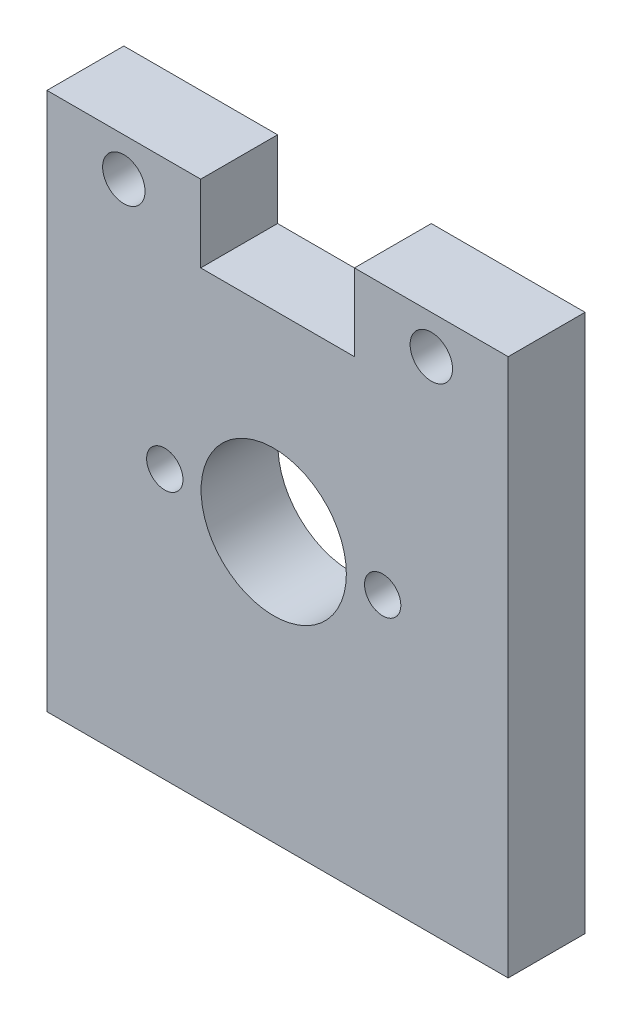
ISO-10303-21;
HEADER;
FILE_DESCRIPTION(('STEP AP214'),'2;1');
FILE_NAME('part.step','',(''),(''),'','','');
FILE_SCHEMA(('AUTOMOTIVE_DESIGN { 1 0 10303 214 1 1 1 1 }'));
ENDSEC;
DATA;
#1=APPLICATION_CONTEXT('core data for automotive mechanical design processes');
#2=APPLICATION_PROTOCOL_DEFINITION('international standard','automotive_design',2000,#1);
#3=PRODUCT_CONTEXT('',#1,'mechanical');
#4=PRODUCT('Part','Part','',(#3));
#5=PRODUCT_RELATED_PRODUCT_CATEGORY('part','',(#4));
#6=PRODUCT_DEFINITION_FORMATION('','',#4);
#7=PRODUCT_DEFINITION_CONTEXT('part definition',#1,'design');
#8=PRODUCT_DEFINITION('design','',#6,#7);
#9=PRODUCT_DEFINITION_SHAPE('','',#8);
#10=(LENGTH_UNIT() NAMED_UNIT(*) SI_UNIT(.MILLI.,.METRE.));
#11=(NAMED_UNIT(*) PLANE_ANGLE_UNIT() SI_UNIT($,.RADIAN.));
#12=(NAMED_UNIT(*) SI_UNIT($,.STERADIAN.) SOLID_ANGLE_UNIT());
#13=UNCERTAINTY_MEASURE_WITH_UNIT(LENGTH_MEASURE(1.E-05),#10,'distance_accuracy_value','');
#14=(GEOMETRIC_REPRESENTATION_CONTEXT(3) GLOBAL_UNCERTAINTY_ASSIGNED_CONTEXT((#13)) GLOBAL_UNIT_ASSIGNED_CONTEXT((#10,
#11,#12)) REPRESENTATION_CONTEXT('',''));
#15=CARTESIAN_POINT('',(0.,0.,0.));
#16=DIRECTION('',(0.,0.,1.));
#17=DIRECTION('',(1.,0.,0.));
#18=AXIS2_PLACEMENT_3D('',#15,#16,#17);
#19=CARTESIAN_POINT('',(0.,0.,3.175));
#20=DIRECTION('',(0.,-1.,0.));
#21=DIRECTION('',(0.,0.,-1.));
#22=AXIS2_PLACEMENT_3D('',#19,#20,#21);
#23=PLANE('',#22);
#24=DIRECTION('',(-1.,0.,0.));
#25=VECTOR('',#24,1.);
#26=CARTESIAN_POINT('',(0.,0.,-3.175));
#27=LINE('',#26,#25);
#28=CARTESIAN_POINT('',(38.1,0.,-3.175));
#29=VERTEX_POINT('',#28);
#30=CARTESIAN_POINT('',(25.4,0.,-3.175));
#31=VERTEX_POINT('',#30);
#32=EDGE_CURVE('E127',#29,#31,#27,.T.);
#33=ORIENTED_EDGE('',*,*,#32,.T.);
#34=DIRECTION('',(0.,0.,1.));
#35=VECTOR('',#34,1.);
#36=CARTESIAN_POINT('',(25.4,0.,-3.176));
#37=LINE('',#36,#35);
#38=CARTESIAN_POINT('',(25.4,0.,3.175));
#39=VERTEX_POINT('',#38);
#40=EDGE_CURVE('E110',#31,#39,#37,.T.);
#41=ORIENTED_EDGE('',*,*,#40,.T.);
#42=DIRECTION('',(-1.,0.,0.));
#43=VECTOR('',#42,1.);
#44=CARTESIAN_POINT('',(0.,0.,3.175));
#45=LINE('',#44,#43);
#46=CARTESIAN_POINT('',(38.1,0.,3.175));
#47=VERTEX_POINT('',#46);
#48=EDGE_CURVE('E142',#47,#39,#45,.T.);
#49=ORIENTED_EDGE('',*,*,#48,.F.);
#50=DIRECTION('',(0.,0.,-1.));
#51=VECTOR('',#50,1.);
#52=CARTESIAN_POINT('',(38.1,0.,3.175));
#53=LINE('',#52,#51);
#54=EDGE_CURVE('E132',#47,#29,#53,.T.);
#55=ORIENTED_EDGE('',*,*,#54,.T.);
#56=EDGE_LOOP('',(#33,#41,#49,#55));
#57=FACE_BOUND('',#56,.T.);
#58=ADVANCED_FACE('F35',(#57),#23,.F.);
#59=CARTESIAN_POINT('',(0.,0.,3.175));
#60=DIRECTION('',(1.,0.,0.));
#61=DIRECTION('',(0.,1.,0.));
#62=AXIS2_PLACEMENT_3D('',#59,#60,#61);
#63=PLANE('',#62);
#64=DIRECTION('',(0.,-1.,0.));
#65=VECTOR('',#64,1.);
#66=CARTESIAN_POINT('',(0.,0.,-3.175));
#67=LINE('',#66,#65);
#68=CARTESIAN_POINT('',(0.,0.,-3.175));
#69=VERTEX_POINT('',#68);
#70=CARTESIAN_POINT('',(0.,-44.45,-3.175));
#71=VERTEX_POINT('',#70);
#72=EDGE_CURVE('E150',#69,#71,#67,.T.);
#73=ORIENTED_EDGE('',*,*,#72,.T.);
#74=DIRECTION('',(0.,0.,-1.));
#75=VECTOR('',#74,1.);
#76=CARTESIAN_POINT('',(0.,-44.45,3.175));
#77=LINE('',#76,#75);
#78=CARTESIAN_POINT('',(0.,-44.45,3.175));
#79=VERTEX_POINT('',#78);
#80=EDGE_CURVE('E11',#79,#71,#77,.T.);
#81=ORIENTED_EDGE('',*,*,#80,.F.);
#82=DIRECTION('',(0.,-1.,0.));
#83=VECTOR('',#82,1.);
#84=CARTESIAN_POINT('',(0.,0.,3.175));
#85=LINE('',#84,#83);
#86=CARTESIAN_POINT('',(0.,0.,3.175));
#87=VERTEX_POINT('',#86);
#88=EDGE_CURVE('E133',#87,#79,#85,.T.);
#89=ORIENTED_EDGE('',*,*,#88,.F.);
#90=DIRECTION('',(0.,0.,-1.));
#91=VECTOR('',#90,1.);
#92=CARTESIAN_POINT('',(0.,0.,3.175));
#93=LINE('',#92,#91);
#94=EDGE_CURVE('E140',#87,#69,#93,.T.);
#95=ORIENTED_EDGE('',*,*,#94,.T.);
#96=EDGE_LOOP('',(#73,#81,#89,#95));
#97=FACE_BOUND('',#96,.T.);
#98=ADVANCED_FACE('F37',(#97),#63,.F.);
#99=CARTESIAN_POINT('',(0.,-44.45,3.175));
#100=DIRECTION('',(0.,1.,0.));
#101=DIRECTION('',(0.,0.,1.));
#102=AXIS2_PLACEMENT_3D('',#99,#100,#101);
#103=PLANE('',#102);
#104=DIRECTION('',(1.,0.,0.));
#105=VECTOR('',#104,1.);
#106=CARTESIAN_POINT('',(0.,-44.45,-3.175));
#107=LINE('',#106,#105);
#108=CARTESIAN_POINT('',(38.1,-44.45,-3.175));
#109=VERTEX_POINT('',#108);
#110=EDGE_CURVE('E149',#71,#109,#107,.T.);
#111=ORIENTED_EDGE('',*,*,#110,.T.);
#112=DIRECTION('',(0.,0.,-1.));
#113=VECTOR('',#112,1.);
#114=CARTESIAN_POINT('',(38.1,-44.45,3.175));
#115=LINE('',#114,#113);
#116=CARTESIAN_POINT('',(38.1,-44.45,3.175));
#117=VERTEX_POINT('',#116);
#118=EDGE_CURVE('E43',#117,#109,#115,.T.);
#119=ORIENTED_EDGE('',*,*,#118,.F.);
#120=DIRECTION('',(1.,0.,0.));
#121=VECTOR('',#120,1.);
#122=CARTESIAN_POINT('',(0.,-44.45,3.175));
#123=LINE('',#122,#121);
#124=EDGE_CURVE('E88',#79,#117,#123,.T.);
#125=ORIENTED_EDGE('',*,*,#124,.F.);
#126=ORIENTED_EDGE('',*,*,#80,.T.);
#127=EDGE_LOOP('',(#111,#119,#125,#126));
#128=FACE_BOUND('',#127,.T.);
#129=ADVANCED_FACE('F237',(#128),#103,.F.);
#130=CARTESIAN_POINT('',(38.1,-44.45,3.175));
#131=DIRECTION('',(-1.,0.,0.));
#132=DIRECTION('',(0.,0.,1.));
#133=AXIS2_PLACEMENT_3D('',#130,#131,#132);
#134=PLANE('',#133);
#135=DIRECTION('',(0.,1.,0.));
#136=VECTOR('',#135,1.);
#137=CARTESIAN_POINT('',(38.1,-44.45,-3.175));
#138=LINE('',#137,#136);
#139=EDGE_CURVE('E136',#109,#29,#138,.T.);
#140=ORIENTED_EDGE('',*,*,#139,.T.);
#141=ORIENTED_EDGE('',*,*,#54,.F.);
#142=DIRECTION('',(0.,1.,0.));
#143=VECTOR('',#142,1.);
#144=CARTESIAN_POINT('',(38.1,-44.45,3.175));
#145=LINE('',#144,#143);
#146=EDGE_CURVE('E147',#117,#47,#145,.T.);
#147=ORIENTED_EDGE('',*,*,#146,.F.);
#148=ORIENTED_EDGE('',*,*,#118,.T.);
#149=EDGE_LOOP('',(#140,#141,#147,#148));
#150=FACE_BOUND('',#149,.T.);
#151=ADVANCED_FACE('F146',(#150),#134,.F.);
#152=CARTESIAN_POINT('',(12.7,0.,3.175));
#153=VERTEX_POINT('',#152);
#154=EDGE_CURVE('E59',#153,#87,#45,.T.);
#155=ORIENTED_EDGE('',*,*,#154,.F.);
#156=DIRECTION('',(0.,0.,1.));
#157=VECTOR('',#156,1.);
#158=CARTESIAN_POINT('',(12.7,0.,-3.176));
#159=LINE('',#158,#157);
#160=CARTESIAN_POINT('',(12.7,0.,-3.175));
#161=VERTEX_POINT('',#160);
#162=EDGE_CURVE('E120',#161,#153,#159,.T.);
#163=ORIENTED_EDGE('',*,*,#162,.F.);
#164=EDGE_CURVE('E81',#161,#69,#27,.T.);
#165=ORIENTED_EDGE('',*,*,#164,.T.);
#166=ORIENTED_EDGE('',*,*,#94,.F.);
#167=EDGE_LOOP('',(#155,#163,#165,#166));
#168=FACE_BOUND('',#167,.T.);
#169=ADVANCED_FACE('F207',(#168),#23,.F.);
#170=CARTESIAN_POINT('',(0.,0.,3.175));
#171=DIRECTION('',(0.,0.,1.));
#172=DIRECTION('',(1.,0.,0.));
#173=AXIS2_PLACEMENT_3D('',#170,#171,#172);
#174=PLANE('',#173);
#175=CARTESIAN_POINT('',(9.7325,-22.2250000000005,3.175));
#176=DIRECTION('',(0.,0.,1.));
#177=DIRECTION('',(1.,0.,0.));
#178=AXIS2_PLACEMENT_3D('',#175,#176,#177);
#179=CIRCLE('',#178,1.5);
#180=CARTESIAN_POINT('',(11.2325,-22.2250000000005,3.175));
#181=VERTEX_POINT('',#180);
#182=EDGE_CURVE('E198',#181,#181,#179,.T.);
#183=ORIENTED_EDGE('',*,*,#182,.F.);
#184=EDGE_LOOP('',(#183));
#185=FACE_BOUND('',#184,.T.);
#186=CARTESIAN_POINT('',(27.7325,-22.2250000000005,3.175));
#187=DIRECTION('',(0.,0.,1.));
#188=DIRECTION('',(1.,0.,0.));
#189=AXIS2_PLACEMENT_3D('',#186,#187,#188);
#190=CIRCLE('',#189,1.5);
#191=CARTESIAN_POINT('',(29.2325,-22.2250000000005,3.175));
#192=VERTEX_POINT('',#191);
#193=EDGE_CURVE('E192',#192,#192,#190,.T.);
#194=ORIENTED_EDGE('',*,*,#193,.F.);
#195=EDGE_LOOP('',(#194));
#196=FACE_BOUND('',#195,.T.);
#197=CARTESIAN_POINT('',(18.7325,-22.2250000000005,3.175));
#198=DIRECTION('',(0.,0.,1.));
#199=DIRECTION('',(1.,0.,0.));
#200=AXIS2_PLACEMENT_3D('',#197,#198,#199);
#201=CIRCLE('',#200,6.);
#202=CARTESIAN_POINT('',(24.7325,-22.2250000000005,3.175));
#203=VERTEX_POINT('',#202);
#204=EDGE_CURVE('E186',#203,#203,#201,.T.);
#205=ORIENTED_EDGE('',*,*,#204,.F.);
#206=EDGE_LOOP('',(#205));
#207=FACE_BOUND('',#206,.T.);
#208=DIRECTION('',(0.,1.,0.));
#209=VECTOR('',#208,1.);
#210=CARTESIAN_POINT('',(25.4,-6.35,3.175));
#211=LINE('',#210,#209);
#212=CARTESIAN_POINT('',(25.4,-6.35,3.175));
#213=VERTEX_POINT('',#212);
#214=EDGE_CURVE('E115',#213,#39,#211,.T.);
#215=ORIENTED_EDGE('',*,*,#214,.F.);
#216=DIRECTION('',(1.,0.,0.));
#217=VECTOR('',#216,1.);
#218=CARTESIAN_POINT('',(25.4,-6.35,3.175));
#219=LINE('',#218,#217);
#220=CARTESIAN_POINT('',(12.7,-6.35,3.175));
#221=VERTEX_POINT('',#220);
#222=EDGE_CURVE('E121',#221,#213,#219,.T.);
#223=ORIENTED_EDGE('',*,*,#222,.F.);
#224=DIRECTION('',(0.,-1.,0.));
#225=VECTOR('',#224,1.);
#226=CARTESIAN_POINT('',(12.7,-6.35,3.175));
#227=LINE('',#226,#225);
#228=EDGE_CURVE('E176',#153,#221,#227,.T.);
#229=ORIENTED_EDGE('',*,*,#228,.F.);
#230=ORIENTED_EDGE('',*,*,#154,.T.);
#231=ORIENTED_EDGE('',*,*,#88,.T.);
#232=ORIENTED_EDGE('',*,*,#124,.T.);
#233=ORIENTED_EDGE('',*,*,#146,.T.);
#234=ORIENTED_EDGE('',*,*,#48,.T.);
#235=EDGE_LOOP('',(#215,#223,#229,#230,#231,#232,#233,#234));
#236=FACE_BOUND('',#235,.T.);
#237=CARTESIAN_POINT('',(6.35,-3.175,3.175));
#238=DIRECTION('',(0.,0.,1.));
#239=DIRECTION('',(1.,0.,0.));
#240=AXIS2_PLACEMENT_3D('',#237,#238,#239);
#241=CIRCLE('',#240,1.7526);
#242=CARTESIAN_POINT('',(8.1026,-3.175,3.175));
#243=VERTEX_POINT('',#242);
#244=EDGE_CURVE('E166',#243,#243,#241,.T.);
#245=ORIENTED_EDGE('',*,*,#244,.F.);
#246=EDGE_LOOP('',(#245));
#247=FACE_BOUND('',#246,.T.);
#248=CARTESIAN_POINT('',(31.75,-3.175,3.175));
#249=DIRECTION('',(0.,0.,1.));
#250=DIRECTION('',(1.,0.,0.));
#251=AXIS2_PLACEMENT_3D('',#248,#249,#250);
#252=CIRCLE('',#251,1.7526);
#253=CARTESIAN_POINT('',(33.5026,-3.175,3.175));
#254=VERTEX_POINT('',#253);
#255=EDGE_CURVE('E160',#254,#254,#252,.T.);
#256=ORIENTED_EDGE('',*,*,#255,.F.);
#257=EDGE_LOOP('',(#256));
#258=FACE_BOUND('',#257,.T.);
#259=ADVANCED_FACE('F204',(#185,#196,#207,#236,#247,#258),#174,.T.);
#260=CARTESIAN_POINT('',(0.,0.,-3.175));
#261=DIRECTION('',(0.,0.,1.));
#262=DIRECTION('',(1.,0.,0.));
#263=AXIS2_PLACEMENT_3D('',#260,#261,#262);
#264=PLANE('',#263);
#265=CARTESIAN_POINT('',(9.7325,-22.2250000000005,-3.175));
#266=DIRECTION('',(0.,0.,1.));
#267=DIRECTION('',(1.,0.,0.));
#268=AXIS2_PLACEMENT_3D('',#265,#266,#267);
#269=CIRCLE('',#268,1.5);
#270=CARTESIAN_POINT('',(11.2325,-22.2250000000005,-3.175));
#271=VERTEX_POINT('',#270);
#272=EDGE_CURVE('E195',#271,#271,#269,.T.);
#273=ORIENTED_EDGE('',*,*,#272,.T.);
#274=EDGE_LOOP('',(#273));
#275=FACE_BOUND('',#274,.T.);
#276=CARTESIAN_POINT('',(27.7325,-22.2250000000005,-3.175));
#277=DIRECTION('',(0.,0.,1.));
#278=DIRECTION('',(1.,0.,0.));
#279=AXIS2_PLACEMENT_3D('',#276,#277,#278);
#280=CIRCLE('',#279,1.5);
#281=CARTESIAN_POINT('',(29.2325,-22.2250000000005,-3.175));
#282=VERTEX_POINT('',#281);
#283=EDGE_CURVE('E189',#282,#282,#280,.T.);
#284=ORIENTED_EDGE('',*,*,#283,.T.);
#285=EDGE_LOOP('',(#284));
#286=FACE_BOUND('',#285,.T.);
#287=CARTESIAN_POINT('',(18.7325,-22.2250000000005,-3.175));
#288=DIRECTION('',(0.,0.,1.));
#289=DIRECTION('',(1.,0.,0.));
#290=AXIS2_PLACEMENT_3D('',#287,#288,#289);
#291=CIRCLE('',#290,6.);
#292=CARTESIAN_POINT('',(24.7325,-22.2250000000005,-3.175));
#293=VERTEX_POINT('',#292);
#294=EDGE_CURVE('E183',#293,#293,#291,.F.);
#295=ORIENTED_EDGE('',*,*,#294,.F.);
#296=EDGE_LOOP('',(#295));
#297=FACE_BOUND('',#296,.T.);
#298=CARTESIAN_POINT('',(6.35,-3.175,-3.175));
#299=DIRECTION('',(0.,0.,1.));
#300=DIRECTION('',(1.,0.,0.));
#301=AXIS2_PLACEMENT_3D('',#298,#299,#300);
#302=CIRCLE('',#301,1.7526);
#303=CARTESIAN_POINT('',(8.1026,-3.175,-3.175));
#304=VERTEX_POINT('',#303);
#305=EDGE_CURVE('E163',#304,#304,#302,.T.);
#306=ORIENTED_EDGE('',*,*,#305,.T.);
#307=EDGE_LOOP('',(#306));
#308=FACE_BOUND('',#307,.T.);
#309=CARTESIAN_POINT('',(31.75,-3.175,-3.175));
#310=DIRECTION('',(0.,0.,1.));
#311=DIRECTION('',(1.,0.,0.));
#312=AXIS2_PLACEMENT_3D('',#309,#310,#311);
#313=CIRCLE('',#312,1.7526);
#314=CARTESIAN_POINT('',(33.5026,-3.175,-3.175));
#315=VERTEX_POINT('',#314);
#316=EDGE_CURVE('E152',#315,#315,#313,.T.);
#317=ORIENTED_EDGE('',*,*,#316,.T.);
#318=EDGE_LOOP('',(#317));
#319=FACE_BOUND('',#318,.T.);
#320=DIRECTION('',(-1.,0.,0.));
#321=VECTOR('',#320,1.);
#322=CARTESIAN_POINT('',(25.4,-6.35,-3.175));
#323=LINE('',#322,#321);
#324=CARTESIAN_POINT('',(25.4,-6.35,-3.175));
#325=VERTEX_POINT('',#324);
#326=CARTESIAN_POINT('',(12.7,-6.35,-3.175));
#327=VERTEX_POINT('',#326);
#328=EDGE_CURVE('E50',#325,#327,#323,.T.);
#329=ORIENTED_EDGE('',*,*,#328,.F.);
#330=DIRECTION('',(0.,-1.,0.));
#331=VECTOR('',#330,1.);
#332=CARTESIAN_POINT('',(25.4,-6.35,-3.175));
#333=LINE('',#332,#331);
#334=EDGE_CURVE('E113',#31,#325,#333,.T.);
#335=ORIENTED_EDGE('',*,*,#334,.F.);
#336=ORIENTED_EDGE('',*,*,#32,.F.);
#337=ORIENTED_EDGE('',*,*,#139,.F.);
#338=ORIENTED_EDGE('',*,*,#110,.F.);
#339=ORIENTED_EDGE('',*,*,#72,.F.);
#340=ORIENTED_EDGE('',*,*,#164,.F.);
#341=DIRECTION('',(0.,1.,0.));
#342=VECTOR('',#341,1.);
#343=CARTESIAN_POINT('',(12.7,-6.35,-3.175));
#344=LINE('',#343,#342);
#345=EDGE_CURVE('E181',#327,#161,#344,.T.);
#346=ORIENTED_EDGE('',*,*,#345,.F.);
#347=EDGE_LOOP('',(#329,#335,#336,#337,#338,#339,#340,#346));
#348=FACE_BOUND('',#347,.T.);
#349=ADVANCED_FACE('F125',(#275,#286,#297,#308,#319,#348),#264,.F.);
#350=CARTESIAN_POINT('',(31.75,-3.175,3.175));
#351=DIRECTION('',(0.,0.,1.));
#352=DIRECTION('',(1.,0.,0.));
#353=AXIS2_PLACEMENT_3D('',#350,#351,#352);
#354=CYLINDRICAL_SURFACE('',#353,1.7526);
#355=ORIENTED_EDGE('',*,*,#316,.F.);
#356=EDGE_LOOP('',(#355));
#357=FACE_BOUND('',#356,.T.);
#358=ORIENTED_EDGE('',*,*,#255,.T.);
#359=EDGE_LOOP('',(#358));
#360=FACE_BOUND('',#359,.T.);
#361=ADVANCED_FACE('F218',(#357,#360),#354,.F.);
#362=CARTESIAN_POINT('',(6.35,-3.175,3.175));
#363=DIRECTION('',(0.,0.,1.));
#364=DIRECTION('',(1.,0.,0.));
#365=AXIS2_PLACEMENT_3D('',#362,#363,#364);
#366=CYLINDRICAL_SURFACE('',#365,1.7526);
#367=ORIENTED_EDGE('',*,*,#305,.F.);
#368=EDGE_LOOP('',(#367));
#369=FACE_BOUND('',#368,.T.);
#370=ORIENTED_EDGE('',*,*,#244,.T.);
#371=EDGE_LOOP('',(#370));
#372=FACE_BOUND('',#371,.T.);
#373=ADVANCED_FACE('F220',(#369,#372),#366,.F.);
#374=CARTESIAN_POINT('',(25.4,-6.35,-3.176));
#375=DIRECTION('',(1.,0.,0.));
#376=DIRECTION('',(0.,0.,-1.));
#377=AXIS2_PLACEMENT_3D('',#374,#375,#376);
#378=PLANE('',#377);
#379=ORIENTED_EDGE('',*,*,#334,.T.);
#380=DIRECTION('',(0.,0.,1.));
#381=VECTOR('',#380,1.);
#382=CARTESIAN_POINT('',(25.4,-6.35,-3.176));
#383=LINE('',#382,#381);
#384=EDGE_CURVE('E168',#325,#213,#383,.T.);
#385=ORIENTED_EDGE('',*,*,#384,.T.);
#386=ORIENTED_EDGE('',*,*,#214,.T.);
#387=ORIENTED_EDGE('',*,*,#40,.F.);
#388=EDGE_LOOP('',(#379,#385,#386,#387));
#389=FACE_BOUND('',#388,.T.);
#390=ADVANCED_FACE('F112',(#389),#378,.F.);
#391=CARTESIAN_POINT('',(25.4,-6.35,-3.176));
#392=DIRECTION('',(0.,-1.,0.));
#393=DIRECTION('',(1.,0.,0.));
#394=AXIS2_PLACEMENT_3D('',#391,#392,#393);
#395=PLANE('',#394);
#396=ORIENTED_EDGE('',*,*,#328,.T.);
#397=DIRECTION('',(0.,0.,1.));
#398=VECTOR('',#397,1.);
#399=CARTESIAN_POINT('',(12.7,-6.35,-3.176));
#400=LINE('',#399,#398);
#401=EDGE_CURVE('E171',#327,#221,#400,.T.);
#402=ORIENTED_EDGE('',*,*,#401,.T.);
#403=ORIENTED_EDGE('',*,*,#222,.T.);
#404=ORIENTED_EDGE('',*,*,#384,.F.);
#405=EDGE_LOOP('',(#396,#402,#403,#404));
#406=FACE_BOUND('',#405,.T.);
#407=ADVANCED_FACE('F284',(#406),#395,.F.);
#408=CARTESIAN_POINT('',(12.7,-6.35,-3.176));
#409=DIRECTION('',(-1.,0.,0.));
#410=DIRECTION('',(0.,-1.,0.));
#411=AXIS2_PLACEMENT_3D('',#408,#409,#410);
#412=PLANE('',#411);
#413=ORIENTED_EDGE('',*,*,#345,.T.);
#414=ORIENTED_EDGE('',*,*,#162,.T.);
#415=ORIENTED_EDGE('',*,*,#228,.T.);
#416=ORIENTED_EDGE('',*,*,#401,.F.);
#417=EDGE_LOOP('',(#413,#414,#415,#416));
#418=FACE_BOUND('',#417,.T.);
#419=ADVANCED_FACE('F293',(#418),#412,.F.);
#420=CARTESIAN_POINT('',(18.7325,-22.2250000000005,-3.176));
#421=DIRECTION('',(0.,0.,1.));
#422=DIRECTION('',(1.,0.,0.));
#423=AXIS2_PLACEMENT_3D('',#420,#421,#422);
#424=CYLINDRICAL_SURFACE('',#423,6.);
#425=ORIENTED_EDGE('',*,*,#204,.T.);
#426=EDGE_LOOP('',(#425));
#427=FACE_BOUND('',#426,.T.);
#428=ORIENTED_EDGE('',*,*,#294,.T.);
#429=EDGE_LOOP('',(#428));
#430=FACE_BOUND('',#429,.T.);
#431=ADVANCED_FACE('F302',(#427,#430),#424,.F.);
#432=CARTESIAN_POINT('',(27.7325,-22.2250000000005,3.175));
#433=DIRECTION('',(0.,0.,1.));
#434=DIRECTION('',(1.,0.,0.));
#435=AXIS2_PLACEMENT_3D('',#432,#433,#434);
#436=CYLINDRICAL_SURFACE('',#435,1.5);
#437=ORIENTED_EDGE('',*,*,#283,.F.);
#438=EDGE_LOOP('',(#437));
#439=FACE_BOUND('',#438,.T.);
#440=ORIENTED_EDGE('',*,*,#193,.T.);
#441=EDGE_LOOP('',(#440));
#442=FACE_BOUND('',#441,.T.);
#443=ADVANCED_FACE('F312',(#439,#442),#436,.F.);
#444=CARTESIAN_POINT('',(9.7325,-22.2250000000005,3.175));
#445=DIRECTION('',(0.,0.,1.));
#446=DIRECTION('',(1.,0.,0.));
#447=AXIS2_PLACEMENT_3D('',#444,#445,#446);
#448=CYLINDRICAL_SURFACE('',#447,1.5);
#449=ORIENTED_EDGE('',*,*,#272,.F.);
#450=EDGE_LOOP('',(#449));
#451=FACE_BOUND('',#450,.T.);
#452=ORIENTED_EDGE('',*,*,#182,.T.);
#453=EDGE_LOOP('',(#452));
#454=FACE_BOUND('',#453,.T.);
#455=ADVANCED_FACE('F202',(#451,#454),#448,.F.);
#456=CLOSED_SHELL('',(#58,#98,#129,#151,#169,#259,#349,#361,#373,#390,#407,#419,#431,#443,#455));
#457=MANIFOLD_SOLID_BREP('B2',#456);
#458=ADVANCED_BREP_SHAPE_REPRESENTATION('',(#18,#457),#14);
#459=SHAPE_DEFINITION_REPRESENTATION(#9,#458);
ENDSEC;
END-ISO-10303-21;
